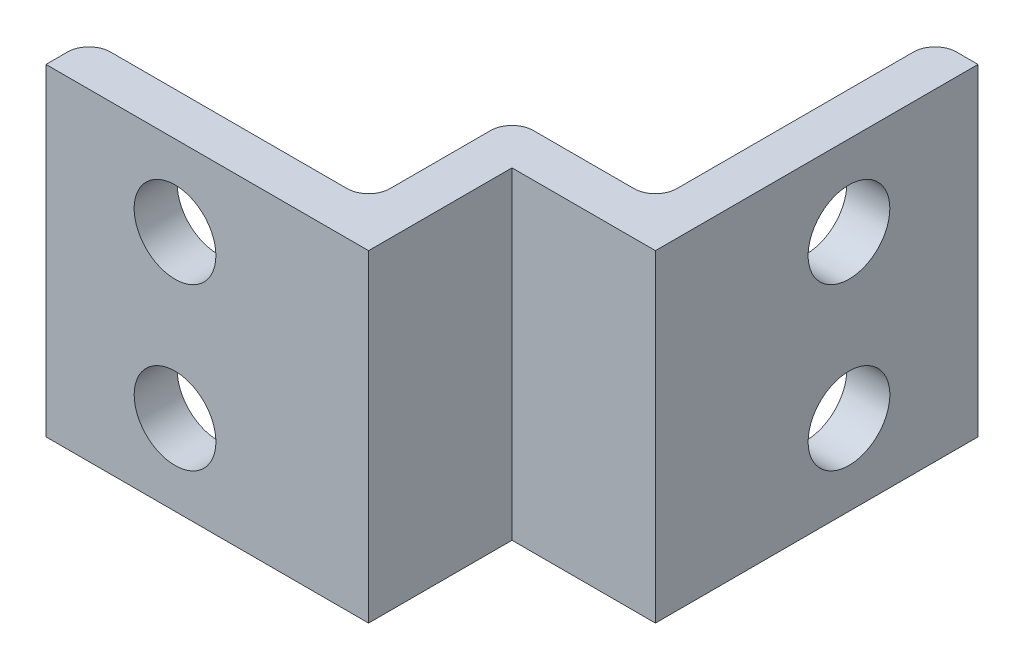
ISO-10303-21;
HEADER;
FILE_DESCRIPTION(('STEP AP214'),'2;1');
FILE_NAME('part.step','',(''),(''),'','','');
FILE_SCHEMA(('AUTOMOTIVE_DESIGN { 1 0 10303 214 1 1 1 1 }'));
ENDSEC;
DATA;
#1=APPLICATION_CONTEXT('core data for automotive mechanical design processes');
#2=APPLICATION_PROTOCOL_DEFINITION('international standard','automotive_design',2000,#1);
#3=PRODUCT_CONTEXT('',#1,'mechanical');
#4=PRODUCT('Part','Part','',(#3));
#5=PRODUCT_RELATED_PRODUCT_CATEGORY('part','',(#4));
#6=PRODUCT_DEFINITION_FORMATION('','',#4);
#7=PRODUCT_DEFINITION_CONTEXT('part definition',#1,'design');
#8=PRODUCT_DEFINITION('design','',#6,#7);
#9=PRODUCT_DEFINITION_SHAPE('','',#8);
#10=(LENGTH_UNIT() NAMED_UNIT(*) SI_UNIT(.MILLI.,.METRE.));
#11=(NAMED_UNIT(*) PLANE_ANGLE_UNIT() SI_UNIT($,.RADIAN.));
#12=(NAMED_UNIT(*) SI_UNIT($,.STERADIAN.) SOLID_ANGLE_UNIT());
#13=UNCERTAINTY_MEASURE_WITH_UNIT(LENGTH_MEASURE(1.E-05),#10,'distance_accuracy_value','');
#14=(GEOMETRIC_REPRESENTATION_CONTEXT(3) GLOBAL_UNCERTAINTY_ASSIGNED_CONTEXT((#13)) GLOBAL_UNIT_ASSIGNED_CONTEXT((#10,
#11,#12)) REPRESENTATION_CONTEXT('',''));
#15=CARTESIAN_POINT('',(0.,0.,0.));
#16=DIRECTION('',(0.,0.,1.));
#17=DIRECTION('',(1.,0.,0.));
#18=AXIS2_PLACEMENT_3D('',#15,#16,#17);
#19=CARTESIAN_POINT('',(38.1,0.,-5.08));
#20=DIRECTION('',(1.,0.,0.));
#21=DIRECTION('',(0.,0.,-1.));
#22=AXIS2_PLACEMENT_3D('',#19,#20,#21);
#23=PLANE('',#22);
#24=DIRECTION('',(0.,0.,1.));
#25=VECTOR('',#24,1.);
#26=CARTESIAN_POINT('',(38.1,0.,-5.08));
#27=LINE('',#26,#25);
#28=CARTESIAN_POINT('',(38.1,0.,-16.9418));
#29=VERTEX_POINT('',#28);
#30=CARTESIAN_POINT('',(38.1,0.,0.));
#31=VERTEX_POINT('',#30);
#32=EDGE_CURVE('E215',#29,#31,#27,.T.);
#33=ORIENTED_EDGE('',*,*,#32,.F.);
#34=DIRECTION('',(0.,1.,0.));
#35=VECTOR('',#34,1.);
#36=CARTESIAN_POINT('',(38.1,0.,-16.9418));
#37=LINE('',#36,#35);
#38=CARTESIAN_POINT('',(38.1,38.1,-16.9418));
#39=VERTEX_POINT('',#38);
#40=EDGE_CURVE('E161',#29,#39,#37,.T.);
#41=ORIENTED_EDGE('',*,*,#40,.T.);
#42=DIRECTION('',(0.,0.,1.));
#43=VECTOR('',#42,1.);
#44=CARTESIAN_POINT('',(38.1,38.1,-5.08));
#45=LINE('',#44,#43);
#46=CARTESIAN_POINT('',(38.1,38.1,0.));
#47=VERTEX_POINT('',#46);
#48=EDGE_CURVE('E213',#39,#47,#45,.T.);
#49=ORIENTED_EDGE('',*,*,#48,.T.);
#50=DIRECTION('',(0.,1.,0.));
#51=VECTOR('',#50,1.);
#52=CARTESIAN_POINT('',(38.1,0.,0.));
#53=LINE('',#52,#51);
#54=EDGE_CURVE('E205',#31,#47,#53,.T.);
#55=ORIENTED_EDGE('',*,*,#54,.F.);
#56=EDGE_LOOP('',(#33,#41,#49,#55));
#57=FACE_BOUND('',#56,.T.);
#58=ADVANCED_FACE('F35',(#57),#23,.T.);
#59=CARTESIAN_POINT('',(0.,0.,-5.08));
#60=DIRECTION('',(-1.,0.,0.));
#61=DIRECTION('',(0.,0.,1.));
#62=AXIS2_PLACEMENT_3D('',#59,#60,#61);
#63=PLANE('',#62);
#64=DIRECTION('',(0.,0.,1.));
#65=VECTOR('',#64,1.);
#66=CARTESIAN_POINT('',(0.,38.1,-5.08));
#67=LINE('',#66,#65);
#68=CARTESIAN_POINT('',(0.,38.1,-2.54));
#69=VERTEX_POINT('',#68);
#70=CARTESIAN_POINT('',(0.,38.1,0.));
#71=VERTEX_POINT('',#70);
#72=EDGE_CURVE('E210',#69,#71,#67,.T.);
#73=ORIENTED_EDGE('',*,*,#72,.F.);
#74=DIRECTION('',(0.,-1.,0.));
#75=VECTOR('',#74,1.);
#76=CARTESIAN_POINT('',(0.,0.,-2.54));
#77=LINE('',#76,#75);
#78=CARTESIAN_POINT('',(0.,0.,-2.54));
#79=VERTEX_POINT('',#78);
#80=EDGE_CURVE('E259',#69,#79,#77,.T.);
#81=ORIENTED_EDGE('',*,*,#80,.T.);
#82=DIRECTION('',(0.,0.,1.));
#83=VECTOR('',#82,1.);
#84=CARTESIAN_POINT('',(0.,0.,-5.08));
#85=LINE('',#84,#83);
#86=CARTESIAN_POINT('',(0.,0.,0.));
#87=VERTEX_POINT('',#86);
#88=EDGE_CURVE('E199',#79,#87,#85,.T.);
#89=ORIENTED_EDGE('',*,*,#88,.T.);
#90=DIRECTION('',(0.,-1.,0.));
#91=VECTOR('',#90,1.);
#92=CARTESIAN_POINT('',(0.,0.,0.));
#93=LINE('',#92,#91);
#94=EDGE_CURVE('E192',#71,#87,#93,.T.);
#95=ORIENTED_EDGE('',*,*,#94,.F.);
#96=EDGE_LOOP('',(#73,#81,#89,#95));
#97=FACE_BOUND('',#96,.T.);
#98=ADVANCED_FACE('F265',(#97),#63,.T.);
#99=CARTESIAN_POINT('',(0.,38.1,-5.08));
#100=DIRECTION('',(0.,1.,0.));
#101=DIRECTION('',(0.,0.,1.));
#102=AXIS2_PLACEMENT_3D('',#99,#100,#101);
#103=PLANE('',#102);
#104=DIRECTION('',(-1.,0.,0.));
#105=VECTOR('',#104,1.);
#106=CARTESIAN_POINT('',(0.,38.1,-5.08));
#107=LINE('',#106,#105);
#108=CARTESIAN_POINT('',(30.48,38.1,-5.08));
#109=VERTEX_POINT('',#108);
#110=CARTESIAN_POINT('',(2.54,38.1,-5.08));
#111=VERTEX_POINT('',#110);
#112=EDGE_CURVE('E196',#109,#111,#107,.T.);
#113=ORIENTED_EDGE('',*,*,#112,.T.);
#114=CARTESIAN_POINT('',(2.54,38.1,-2.54));
#115=DIRECTION('',(0.,1.,0.));
#116=DIRECTION('',(0.,0.,1.));
#117=AXIS2_PLACEMENT_3D('',#114,#115,#116);
#118=CIRCLE('',#117,2.54);
#119=EDGE_CURVE('E11',#111,#69,#118,.T.);
#120=ORIENTED_EDGE('',*,*,#119,.T.);
#121=ORIENTED_EDGE('',*,*,#72,.T.);
#122=DIRECTION('',(-1.,0.,0.));
#123=VECTOR('',#122,1.);
#124=CARTESIAN_POINT('',(0.,38.1,0.));
#125=LINE('',#124,#123);
#126=EDGE_CURVE('E197',#47,#71,#125,.T.);
#127=ORIENTED_EDGE('',*,*,#126,.F.);
#128=ORIENTED_EDGE('',*,*,#48,.F.);
#129=DIRECTION('',(1.,0.,0.));
#130=VECTOR('',#129,1.);
#131=CARTESIAN_POINT('',(33.02,38.1,-16.9418));
#132=LINE('',#131,#130);
#133=CARTESIAN_POINT('',(55.0418,38.1,-16.9418));
#134=VERTEX_POINT('',#133);
#135=EDGE_CURVE('E176',#39,#134,#132,.T.);
#136=ORIENTED_EDGE('',*,*,#135,.T.);
#137=DIRECTION('',(0.,0.,-1.));
#138=VECTOR('',#137,1.);
#139=CARTESIAN_POINT('',(55.0418,38.1,-16.9418));
#140=LINE('',#139,#138);
#141=CARTESIAN_POINT('',(55.0418,38.1,-55.0418));
#142=VERTEX_POINT('',#141);
#143=EDGE_CURVE('E162',#134,#142,#140,.T.);
#144=ORIENTED_EDGE('',*,*,#143,.T.);
#145=DIRECTION('',(1.,0.,0.));
#146=VECTOR('',#145,1.);
#147=CARTESIAN_POINT('',(49.9618,38.1,-55.0418));
#148=LINE('',#147,#146);
#149=CARTESIAN_POINT('',(52.5018,38.1,-55.0418));
#150=VERTEX_POINT('',#149);
#151=EDGE_CURVE('E150',#150,#142,#148,.T.);
#152=ORIENTED_EDGE('',*,*,#151,.F.);
#153=CARTESIAN_POINT('',(52.5018,38.1,-52.5018));
#154=DIRECTION('',(0.,1.,0.));
#155=DIRECTION('',(0.,0.,1.));
#156=AXIS2_PLACEMENT_3D('',#153,#154,#155);
#157=CIRCLE('',#156,2.54);
#158=CARTESIAN_POINT('',(49.9618,38.1,-52.5018));
#159=VERTEX_POINT('',#158);
#160=EDGE_CURVE('E222',#150,#159,#157,.T.);
#161=ORIENTED_EDGE('',*,*,#160,.T.);
#162=DIRECTION('',(0.,0.,1.));
#163=VECTOR('',#162,1.);
#164=CARTESIAN_POINT('',(49.9618,38.1,-16.9418));
#165=LINE('',#164,#163);
#166=CARTESIAN_POINT('',(49.9618,38.1,-24.5618));
#167=VERTEX_POINT('',#166);
#168=EDGE_CURVE('E151',#159,#167,#165,.T.);
#169=ORIENTED_EDGE('',*,*,#168,.T.);
#170=CARTESIAN_POINT('',(47.4218,38.1,-24.5618));
#171=DIRECTION('',(0.,1.,0.));
#172=DIRECTION('',(0.,0.,1.));
#173=AXIS2_PLACEMENT_3D('',#170,#171,#172);
#174=CIRCLE('',#173,2.54);
#175=CARTESIAN_POINT('',(47.4218,38.1,-22.0218));
#176=VERTEX_POINT('',#175);
#177=EDGE_CURVE('E234',#167,#176,#174,.F.);
#178=ORIENTED_EDGE('',*,*,#177,.T.);
#179=DIRECTION('',(1.,0.,0.));
#180=VECTOR('',#179,1.);
#181=CARTESIAN_POINT('',(33.02,38.1,-22.0218));
#182=LINE('',#181,#180);
#183=CARTESIAN_POINT('',(35.56,38.1,-22.0218));
#184=VERTEX_POINT('',#183);
#185=EDGE_CURVE('E190',#184,#176,#182,.T.);
#186=ORIENTED_EDGE('',*,*,#185,.F.);
#187=CARTESIAN_POINT('',(35.56,38.1,-19.4818));
#188=DIRECTION('',(0.,1.,0.));
#189=DIRECTION('',(0.,0.,1.));
#190=AXIS2_PLACEMENT_3D('',#187,#188,#189);
#191=CIRCLE('',#190,2.54);
#192=CARTESIAN_POINT('',(33.02,38.1,-19.4818));
#193=VERTEX_POINT('',#192);
#194=EDGE_CURVE('E242',#184,#193,#191,.T.);
#195=ORIENTED_EDGE('',*,*,#194,.T.);
#196=DIRECTION('',(0.,0.,1.));
#197=VECTOR('',#196,1.);
#198=CARTESIAN_POINT('',(33.02,38.1,0.));
#199=LINE('',#198,#197);
#200=CARTESIAN_POINT('',(33.02,38.1,-7.62));
#201=VERTEX_POINT('',#200);
#202=EDGE_CURVE('E186',#193,#201,#199,.T.);
#203=ORIENTED_EDGE('',*,*,#202,.T.);
#204=CARTESIAN_POINT('',(30.48,38.1,-7.62));
#205=DIRECTION('',(0.,1.,0.));
#206=DIRECTION('',(0.,0.,1.));
#207=AXIS2_PLACEMENT_3D('',#204,#205,#206);
#208=CIRCLE('',#207,2.54);
#209=EDGE_CURVE('E255',#201,#109,#208,.F.);
#210=ORIENTED_EDGE('',*,*,#209,.T.);
#211=EDGE_LOOP('',(#113,#120,#121,#127,#128,#136,#144,#152,#161,#169,#178,#186,#195,#203,#210));
#212=FACE_BOUND('',#211,.T.);
#213=ADVANCED_FACE('F277',(#212),#103,.T.);
#214=CARTESIAN_POINT('',(0.,0.,-5.08));
#215=DIRECTION('',(0.,-1.,0.));
#216=DIRECTION('',(0.,0.,-1.));
#217=AXIS2_PLACEMENT_3D('',#214,#215,#216);
#218=PLANE('',#217);
#219=ORIENTED_EDGE('',*,*,#88,.F.);
#220=CARTESIAN_POINT('',(2.54,0.,-2.54));
#221=DIRECTION('',(0.,-1.,0.));
#222=DIRECTION('',(0.,0.,-1.));
#223=AXIS2_PLACEMENT_3D('',#220,#221,#222);
#224=CIRCLE('',#223,2.54);
#225=CARTESIAN_POINT('',(2.54,0.,-5.08));
#226=VERTEX_POINT('',#225);
#227=EDGE_CURVE('E57',#79,#226,#224,.T.);
#228=ORIENTED_EDGE('',*,*,#227,.T.);
#229=DIRECTION('',(1.,0.,0.));
#230=VECTOR('',#229,1.);
#231=CARTESIAN_POINT('',(0.,0.,-5.08));
#232=LINE('',#231,#230);
#233=CARTESIAN_POINT('',(30.48,0.,-5.08));
#234=VERTEX_POINT('',#233);
#235=EDGE_CURVE('E194',#226,#234,#232,.T.);
#236=ORIENTED_EDGE('',*,*,#235,.T.);
#237=CARTESIAN_POINT('',(30.48,0.,-7.62));
#238=DIRECTION('',(0.,-1.,0.));
#239=DIRECTION('',(0.,0.,-1.));
#240=AXIS2_PLACEMENT_3D('',#237,#238,#239);
#241=CIRCLE('',#240,2.54);
#242=CARTESIAN_POINT('',(33.02,0.,-7.62));
#243=VERTEX_POINT('',#242);
#244=EDGE_CURVE('E257',#234,#243,#241,.F.);
#245=ORIENTED_EDGE('',*,*,#244,.T.);
#246=DIRECTION('',(0.,0.,-1.));
#247=VECTOR('',#246,1.);
#248=CARTESIAN_POINT('',(33.02,0.,0.));
#249=LINE('',#248,#247);
#250=CARTESIAN_POINT('',(33.02,0.,-19.4818));
#251=VERTEX_POINT('',#250);
#252=EDGE_CURVE('E184',#243,#251,#249,.T.);
#253=ORIENTED_EDGE('',*,*,#252,.T.);
#254=CARTESIAN_POINT('',(35.56,0.,-19.4818));
#255=DIRECTION('',(0.,-1.,0.));
#256=DIRECTION('',(0.,0.,-1.));
#257=AXIS2_PLACEMENT_3D('',#254,#255,#256);
#258=CIRCLE('',#257,2.54);
#259=CARTESIAN_POINT('',(35.56,0.,-22.0218));
#260=VERTEX_POINT('',#259);
#261=EDGE_CURVE('E247',#251,#260,#258,.T.);
#262=ORIENTED_EDGE('',*,*,#261,.T.);
#263=DIRECTION('',(1.,0.,0.));
#264=VECTOR('',#263,1.);
#265=CARTESIAN_POINT('',(33.02,0.,-22.0218));
#266=LINE('',#265,#264);
#267=CARTESIAN_POINT('',(47.4218,0.,-22.0218));
#268=VERTEX_POINT('',#267);
#269=EDGE_CURVE('E189',#260,#268,#266,.T.);
#270=ORIENTED_EDGE('',*,*,#269,.T.);
#271=CARTESIAN_POINT('',(47.4218,0.,-24.5618));
#272=DIRECTION('',(0.,-1.,0.));
#273=DIRECTION('',(0.,0.,-1.));
#274=AXIS2_PLACEMENT_3D('',#271,#272,#273);
#275=CIRCLE('',#274,2.54);
#276=CARTESIAN_POINT('',(49.9618,0.,-24.5618));
#277=VERTEX_POINT('',#276);
#278=EDGE_CURVE('E237',#268,#277,#275,.F.);
#279=ORIENTED_EDGE('',*,*,#278,.T.);
#280=DIRECTION('',(0.,0.,-1.));
#281=VECTOR('',#280,1.);
#282=CARTESIAN_POINT('',(49.9618,0.,-16.9418));
#283=LINE('',#282,#281);
#284=CARTESIAN_POINT('',(49.9618,0.,-52.5018));
#285=VERTEX_POINT('',#284);
#286=EDGE_CURVE('E167',#277,#285,#283,.T.);
#287=ORIENTED_EDGE('',*,*,#286,.T.);
#288=CARTESIAN_POINT('',(52.5018,0.,-52.5018));
#289=DIRECTION('',(0.,-1.,0.));
#290=DIRECTION('',(0.,0.,-1.));
#291=AXIS2_PLACEMENT_3D('',#288,#289,#290);
#292=CIRCLE('',#291,2.54);
#293=CARTESIAN_POINT('',(52.5018,0.,-55.0418));
#294=VERTEX_POINT('',#293);
#295=EDGE_CURVE('E145',#285,#294,#292,.T.);
#296=ORIENTED_EDGE('',*,*,#295,.T.);
#297=DIRECTION('',(1.,0.,0.));
#298=VECTOR('',#297,1.);
#299=CARTESIAN_POINT('',(49.9618,0.,-55.0418));
#300=LINE('',#299,#298);
#301=CARTESIAN_POINT('',(55.0418,0.,-55.0418));
#302=VERTEX_POINT('',#301);
#303=EDGE_CURVE('E139',#294,#302,#300,.T.);
#304=ORIENTED_EDGE('',*,*,#303,.T.);
#305=DIRECTION('',(0.,0.,-1.));
#306=VECTOR('',#305,1.);
#307=CARTESIAN_POINT('',(55.0418,0.,-16.9418));
#308=LINE('',#307,#306);
#309=CARTESIAN_POINT('',(55.0418,0.,-16.9418));
#310=VERTEX_POINT('',#309);
#311=EDGE_CURVE('E142',#310,#302,#308,.T.);
#312=ORIENTED_EDGE('',*,*,#311,.F.);
#313=DIRECTION('',(-1.,0.,0.));
#314=VECTOR('',#313,1.);
#315=CARTESIAN_POINT('',(33.02,0.,-16.9418));
#316=LINE('',#315,#314);
#317=EDGE_CURVE('E180',#310,#29,#316,.T.);
#318=ORIENTED_EDGE('',*,*,#317,.T.);
#319=ORIENTED_EDGE('',*,*,#32,.T.);
#320=DIRECTION('',(1.,0.,0.));
#321=VECTOR('',#320,1.);
#322=CARTESIAN_POINT('',(0.,0.,0.));
#323=LINE('',#322,#321);
#324=EDGE_CURVE('E202',#87,#31,#323,.T.);
#325=ORIENTED_EDGE('',*,*,#324,.F.);
#326=EDGE_LOOP('',(#219,#228,#236,#245,#253,#262,#270,#279,#287,#296,#304,#312,#318,#319,#325));
#327=FACE_BOUND('',#326,.T.);
#328=ADVANCED_FACE('F141',(#327),#218,.T.);
#329=CARTESIAN_POINT('',(0.,0.,-5.08));
#330=DIRECTION('',(0.,0.,-1.));
#331=DIRECTION('',(-1.,0.,0.));
#332=AXIS2_PLACEMENT_3D('',#329,#330,#331);
#333=PLANE('',#332);
#334=CARTESIAN_POINT('',(15.24,28.575,-5.08));
#335=DIRECTION('',(0.,0.,-1.));
#336=DIRECTION('',(-1.,0.,0.));
#337=AXIS2_PLACEMENT_3D('',#334,#335,#336);
#338=CIRCLE('',#337,4.826);
#339=CARTESIAN_POINT('',(10.414,28.575,-5.08));
#340=VERTEX_POINT('',#339);
#341=EDGE_CURVE('E369',#340,#340,#338,.T.);
#342=ORIENTED_EDGE('',*,*,#341,.F.);
#343=EDGE_LOOP('',(#342));
#344=FACE_BOUND('',#343,.T.);
#345=CARTESIAN_POINT('',(15.24,9.52500000000001,-5.08));
#346=DIRECTION('',(0.,0.,-1.));
#347=DIRECTION('',(-1.,0.,0.));
#348=AXIS2_PLACEMENT_3D('',#345,#346,#347);
#349=CIRCLE('',#348,4.826);
#350=CARTESIAN_POINT('',(10.414,9.52500000000001,-5.08));
#351=VERTEX_POINT('',#350);
#352=EDGE_CURVE('E364',#351,#351,#349,.T.);
#353=ORIENTED_EDGE('',*,*,#352,.F.);
#354=EDGE_LOOP('',(#353));
#355=FACE_BOUND('',#354,.T.);
#356=ORIENTED_EDGE('',*,*,#235,.F.);
#357=DIRECTION('',(0.,-1.,0.));
#358=VECTOR('',#357,1.);
#359=CARTESIAN_POINT('',(2.54,0.,-5.08));
#360=LINE('',#359,#358);
#361=EDGE_CURVE('E43',#226,#111,#360,.F.);
#362=ORIENTED_EDGE('',*,*,#361,.T.);
#363=ORIENTED_EDGE('',*,*,#112,.F.);
#364=DIRECTION('',(0.,1.,0.));
#365=VECTOR('',#364,1.);
#366=CARTESIAN_POINT('',(30.48,0.,-5.08));
#367=LINE('',#366,#365);
#368=EDGE_CURVE('E252',#109,#234,#367,.F.);
#369=ORIENTED_EDGE('',*,*,#368,.T.);
#370=EDGE_LOOP('',(#356,#362,#363,#369));
#371=FACE_BOUND('',#370,.T.);
#372=ADVANCED_FACE('F297',(#344,#355,#371),#333,.T.);
#373=CARTESIAN_POINT('',(0.,0.,0.));
#374=DIRECTION('',(0.,0.,-1.));
#375=DIRECTION('',(-1.,0.,0.));
#376=AXIS2_PLACEMENT_3D('',#373,#374,#375);
#377=PLANE('',#376);
#378=CARTESIAN_POINT('',(15.24,28.575,0.));
#379=DIRECTION('',(0.,0.,1.));
#380=DIRECTION('',(1.,0.,0.));
#381=AXIS2_PLACEMENT_3D('',#378,#379,#380);
#382=CIRCLE('',#381,4.826);
#383=CARTESIAN_POINT('',(20.066,28.575,0.));
#384=VERTEX_POINT('',#383);
#385=EDGE_CURVE('E358',#384,#384,#382,.T.);
#386=ORIENTED_EDGE('',*,*,#385,.F.);
#387=EDGE_LOOP('',(#386));
#388=FACE_BOUND('',#387,.T.);
#389=CARTESIAN_POINT('',(15.24,9.52500000000001,0.));
#390=DIRECTION('',(0.,0.,1.));
#391=DIRECTION('',(-1.,0.,0.));
#392=AXIS2_PLACEMENT_3D('',#389,#390,#391);
#393=CIRCLE('',#392,4.826);
#394=CARTESIAN_POINT('',(10.414,9.52500000000001,0.));
#395=VERTEX_POINT('',#394);
#396=EDGE_CURVE('E361',#395,#395,#393,.T.);
#397=ORIENTED_EDGE('',*,*,#396,.F.);
#398=EDGE_LOOP('',(#397));
#399=FACE_BOUND('',#398,.T.);
#400=ORIENTED_EDGE('',*,*,#324,.T.);
#401=ORIENTED_EDGE('',*,*,#54,.T.);
#402=ORIENTED_EDGE('',*,*,#126,.T.);
#403=ORIENTED_EDGE('',*,*,#94,.T.);
#404=EDGE_LOOP('',(#400,#401,#402,#403));
#405=FACE_BOUND('',#404,.T.);
#406=ADVANCED_FACE('F273',(#388,#399,#405),#377,.F.);
#407=CARTESIAN_POINT('',(33.02,0.,-22.0218));
#408=DIRECTION('',(0.,0.,-1.));
#409=DIRECTION('',(-1.,0.,0.));
#410=AXIS2_PLACEMENT_3D('',#407,#408,#409);
#411=PLANE('',#410);
#412=ORIENTED_EDGE('',*,*,#269,.F.);
#413=DIRECTION('',(0.,1.,0.));
#414=VECTOR('',#413,1.);
#415=CARTESIAN_POINT('',(35.56,0.,-22.0218));
#416=LINE('',#415,#414);
#417=EDGE_CURVE('E239',#260,#184,#416,.T.);
#418=ORIENTED_EDGE('',*,*,#417,.T.);
#419=ORIENTED_EDGE('',*,*,#185,.T.);
#420=DIRECTION('',(0.,1.,0.));
#421=VECTOR('',#420,1.);
#422=CARTESIAN_POINT('',(47.4218,0.,-22.0218));
#423=LINE('',#422,#421);
#424=EDGE_CURVE('E231',#176,#268,#423,.F.);
#425=ORIENTED_EDGE('',*,*,#424,.T.);
#426=EDGE_LOOP('',(#412,#418,#419,#425));
#427=FACE_BOUND('',#426,.T.);
#428=ADVANCED_FACE('F318',(#427),#411,.T.);
#429=CARTESIAN_POINT('',(33.02,0.,0.));
#430=DIRECTION('',(-1.,0.,0.));
#431=DIRECTION('',(0.,0.,1.));
#432=AXIS2_PLACEMENT_3D('',#429,#430,#431);
#433=PLANE('',#432);
#434=ORIENTED_EDGE('',*,*,#252,.F.);
#435=DIRECTION('',(0.,1.,0.));
#436=VECTOR('',#435,1.);
#437=CARTESIAN_POINT('',(33.02,38.1,-7.62));
#438=LINE('',#437,#436);
#439=EDGE_CURVE('E249',#243,#201,#438,.T.);
#440=ORIENTED_EDGE('',*,*,#439,.T.);
#441=ORIENTED_EDGE('',*,*,#202,.F.);
#442=DIRECTION('',(0.,1.,0.));
#443=VECTOR('',#442,1.);
#444=CARTESIAN_POINT('',(33.02,0.,-19.4818));
#445=LINE('',#444,#443);
#446=EDGE_CURVE('E244',#193,#251,#445,.F.);
#447=ORIENTED_EDGE('',*,*,#446,.T.);
#448=EDGE_LOOP('',(#434,#440,#441,#447));
#449=FACE_BOUND('',#448,.T.);
#450=ADVANCED_FACE('F339',(#449),#433,.T.);
#451=CARTESIAN_POINT('',(55.0418,0.,-16.9418));
#452=DIRECTION('',(1.,0.,0.));
#453=DIRECTION('',(0.,0.,-1.));
#454=AXIS2_PLACEMENT_3D('',#451,#452,#453);
#455=PLANE('',#454);
#456=CARTESIAN_POINT('',(55.0418,28.575,-39.8018));
#457=DIRECTION('',(1.,0.,0.));
#458=DIRECTION('',(0.,0.,-1.));
#459=AXIS2_PLACEMENT_3D('',#456,#457,#458);
#460=CIRCLE('',#459,4.826);
#461=CARTESIAN_POINT('',(55.0418,28.575,-44.6278));
#462=VERTEX_POINT('',#461);
#463=EDGE_CURVE('E219',#462,#462,#460,.T.);
#464=ORIENTED_EDGE('',*,*,#463,.F.);
#465=EDGE_LOOP('',(#464));
#466=FACE_BOUND('',#465,.T.);
#467=CARTESIAN_POINT('',(55.0418,9.52500000000001,-39.8018));
#468=DIRECTION('',(1.,0.,0.));
#469=DIRECTION('',(0.,0.,1.));
#470=AXIS2_PLACEMENT_3D('',#467,#468,#469);
#471=CIRCLE('',#470,4.826);
#472=CARTESIAN_POINT('',(55.0418,9.52500000000001,-34.9758));
#473=VERTEX_POINT('',#472);
#474=EDGE_CURVE('E372',#473,#473,#471,.T.);
#475=ORIENTED_EDGE('',*,*,#474,.F.);
#476=EDGE_LOOP('',(#475));
#477=FACE_BOUND('',#476,.T.);
#478=ORIENTED_EDGE('',*,*,#311,.T.);
#479=DIRECTION('',(0.,1.,0.));
#480=VECTOR('',#479,1.);
#481=CARTESIAN_POINT('',(55.0418,0.,-55.0418));
#482=LINE('',#481,#480);
#483=EDGE_CURVE('E157',#302,#142,#482,.T.);
#484=ORIENTED_EDGE('',*,*,#483,.T.);
#485=ORIENTED_EDGE('',*,*,#143,.F.);
#486=DIRECTION('',(0.,-1.,0.));
#487=VECTOR('',#486,1.);
#488=CARTESIAN_POINT('',(55.0418,0.,-16.9418));
#489=LINE('',#488,#487);
#490=EDGE_CURVE('E159',#134,#310,#489,.T.);
#491=ORIENTED_EDGE('',*,*,#490,.T.);
#492=EDGE_LOOP('',(#478,#484,#485,#491));
#493=FACE_BOUND('',#492,.T.);
#494=ADVANCED_FACE('F155',(#466,#477,#493),#455,.T.);
#495=CARTESIAN_POINT('',(0.,0.,-16.9418));
#496=DIRECTION('',(0.,0.,-1.));
#497=DIRECTION('',(-1.,0.,0.));
#498=AXIS2_PLACEMENT_3D('',#495,#496,#497);
#499=PLANE('',#498);
#500=ORIENTED_EDGE('',*,*,#40,.F.);
#501=ORIENTED_EDGE('',*,*,#317,.F.);
#502=ORIENTED_EDGE('',*,*,#490,.F.);
#503=ORIENTED_EDGE('',*,*,#135,.F.);
#504=EDGE_LOOP('',(#500,#501,#502,#503));
#505=FACE_BOUND('',#504,.T.);
#506=ADVANCED_FACE('F331',(#505),#499,.F.);
#507=CARTESIAN_POINT('',(49.9618,0.,-55.0418));
#508=DIRECTION('',(0.,0.,-1.));
#509=DIRECTION('',(-1.,0.,0.));
#510=AXIS2_PLACEMENT_3D('',#507,#508,#509);
#511=PLANE('',#510);
#512=ORIENTED_EDGE('',*,*,#303,.F.);
#513=DIRECTION('',(0.,1.,0.));
#514=VECTOR('',#513,1.);
#515=CARTESIAN_POINT('',(52.5018,0.,-55.0418));
#516=LINE('',#515,#514);
#517=EDGE_CURVE('E212',#294,#150,#516,.T.);
#518=ORIENTED_EDGE('',*,*,#517,.T.);
#519=ORIENTED_EDGE('',*,*,#151,.T.);
#520=ORIENTED_EDGE('',*,*,#483,.F.);
#521=EDGE_LOOP('',(#512,#518,#519,#520));
#522=FACE_BOUND('',#521,.T.);
#523=ADVANCED_FACE('F164',(#522),#511,.T.);
#524=CARTESIAN_POINT('',(49.9618,0.,0.));
#525=DIRECTION('',(-1.,0.,0.));
#526=DIRECTION('',(0.,0.,1.));
#527=AXIS2_PLACEMENT_3D('',#524,#525,#526);
#528=PLANE('',#527);
#529=CARTESIAN_POINT('',(49.9618,28.575,-39.8018));
#530=DIRECTION('',(-1.,0.,0.));
#531=DIRECTION('',(0.,0.,1.));
#532=AXIS2_PLACEMENT_3D('',#529,#530,#531);
#533=CIRCLE('',#532,4.826);
#534=CARTESIAN_POINT('',(49.9618,28.575,-34.9758));
#535=VERTEX_POINT('',#534);
#536=EDGE_CURVE('E168',#535,#535,#533,.T.);
#537=ORIENTED_EDGE('',*,*,#536,.F.);
#538=EDGE_LOOP('',(#537));
#539=FACE_BOUND('',#538,.T.);
#540=CARTESIAN_POINT('',(49.9618,9.52500000000001,-39.8018));
#541=DIRECTION('',(-1.,0.,0.));
#542=DIRECTION('',(0.,0.,1.));
#543=AXIS2_PLACEMENT_3D('',#540,#541,#542);
#544=CIRCLE('',#543,4.826);
#545=CARTESIAN_POINT('',(49.9618,9.52500000000001,-34.9758));
#546=VERTEX_POINT('',#545);
#547=EDGE_CURVE('E172',#546,#546,#544,.T.);
#548=ORIENTED_EDGE('',*,*,#547,.F.);
#549=EDGE_LOOP('',(#548));
#550=FACE_BOUND('',#549,.T.);
#551=ORIENTED_EDGE('',*,*,#286,.F.);
#552=DIRECTION('',(0.,1.,0.));
#553=VECTOR('',#552,1.);
#554=CARTESIAN_POINT('',(49.9618,38.1,-24.5618));
#555=LINE('',#554,#553);
#556=EDGE_CURVE('E228',#277,#167,#555,.T.);
#557=ORIENTED_EDGE('',*,*,#556,.T.);
#558=ORIENTED_EDGE('',*,*,#168,.F.);
#559=DIRECTION('',(0.,1.,0.));
#560=VECTOR('',#559,1.);
#561=CARTESIAN_POINT('',(49.9618,0.,-52.5018));
#562=LINE('',#561,#560);
#563=EDGE_CURVE('E224',#159,#285,#562,.F.);
#564=ORIENTED_EDGE('',*,*,#563,.T.);
#565=EDGE_LOOP('',(#551,#557,#558,#564));
#566=FACE_BOUND('',#565,.T.);
#567=ADVANCED_FACE('F325',(#539,#550,#566),#528,.T.);
#568=CARTESIAN_POINT('',(0.,9.52500000000001,-39.8018));
#569=DIRECTION('',(1.,0.,0.));
#570=DIRECTION('',(0.,0.,-1.));
#571=AXIS2_PLACEMENT_3D('',#568,#569,#570);
#572=CYLINDRICAL_SURFACE('',#571,4.826);
#573=ORIENTED_EDGE('',*,*,#547,.T.);
#574=EDGE_LOOP('',(#573));
#575=FACE_BOUND('',#574,.T.);
#576=ORIENTED_EDGE('',*,*,#474,.T.);
#577=EDGE_LOOP('',(#576));
#578=FACE_BOUND('',#577,.T.);
#579=ADVANCED_FACE('F378',(#575,#578),#572,.F.);
#580=CARTESIAN_POINT('',(0.,28.575,-39.8018));
#581=DIRECTION('',(1.,0.,0.));
#582=DIRECTION('',(0.,0.,-1.));
#583=AXIS2_PLACEMENT_3D('',#580,#581,#582);
#584=CYLINDRICAL_SURFACE('',#583,4.826);
#585=ORIENTED_EDGE('',*,*,#536,.T.);
#586=EDGE_LOOP('',(#585));
#587=FACE_BOUND('',#586,.T.);
#588=ORIENTED_EDGE('',*,*,#463,.T.);
#589=EDGE_LOOP('',(#588));
#590=FACE_BOUND('',#589,.T.);
#591=ADVANCED_FACE('F381',(#587,#590),#584,.F.);
#592=CARTESIAN_POINT('',(15.24,9.52500000000001,-55.0418));
#593=DIRECTION('',(0.,0.,1.));
#594=DIRECTION('',(1.,0.,0.));
#595=AXIS2_PLACEMENT_3D('',#592,#593,#594);
#596=CYLINDRICAL_SURFACE('',#595,4.826);
#597=ORIENTED_EDGE('',*,*,#352,.T.);
#598=EDGE_LOOP('',(#597));
#599=FACE_BOUND('',#598,.T.);
#600=ORIENTED_EDGE('',*,*,#396,.T.);
#601=EDGE_LOOP('',(#600));
#602=FACE_BOUND('',#601,.T.);
#603=ADVANCED_FACE('F388',(#599,#602),#596,.F.);
#604=CARTESIAN_POINT('',(15.24,28.575,-55.0418));
#605=DIRECTION('',(0.,0.,1.));
#606=DIRECTION('',(1.,0.,0.));
#607=AXIS2_PLACEMENT_3D('',#604,#605,#606);
#608=CYLINDRICAL_SURFACE('',#607,4.826);
#609=ORIENTED_EDGE('',*,*,#341,.T.);
#610=EDGE_LOOP('',(#609));
#611=FACE_BOUND('',#610,.T.);
#612=ORIENTED_EDGE('',*,*,#385,.T.);
#613=EDGE_LOOP('',(#612));
#614=FACE_BOUND('',#613,.T.);
#615=ADVANCED_FACE('F303',(#611,#614),#608,.F.);
#616=CARTESIAN_POINT('',(52.5018,0.,-52.5018));
#617=DIRECTION('',(0.,1.,0.));
#618=DIRECTION('',(0.,0.,1.));
#619=AXIS2_PLACEMENT_3D('',#616,#617,#618);
#620=CYLINDRICAL_SURFACE('',#619,2.54);
#621=ORIENTED_EDGE('',*,*,#295,.F.);
#622=ORIENTED_EDGE('',*,*,#563,.F.);
#623=ORIENTED_EDGE('',*,*,#160,.F.);
#624=ORIENTED_EDGE('',*,*,#517,.F.);
#625=EDGE_LOOP('',(#621,#622,#623,#624));
#626=FACE_BOUND('',#625,.T.);
#627=ADVANCED_FACE('F299',(#626),#620,.T.);
#628=CARTESIAN_POINT('',(47.4218,0.,-24.5618));
#629=DIRECTION('',(0.,-1.,0.));
#630=DIRECTION('',(0.,0.,-1.));
#631=AXIS2_PLACEMENT_3D('',#628,#629,#630);
#632=CYLINDRICAL_SURFACE('',#631,2.54);
#633=ORIENTED_EDGE('',*,*,#278,.F.);
#634=ORIENTED_EDGE('',*,*,#424,.F.);
#635=ORIENTED_EDGE('',*,*,#177,.F.);
#636=ORIENTED_EDGE('',*,*,#556,.F.);
#637=EDGE_LOOP('',(#633,#634,#635,#636));
#638=FACE_BOUND('',#637,.T.);
#639=ADVANCED_FACE('F302',(#638),#632,.F.);
#640=CARTESIAN_POINT('',(35.56,0.,-19.4818));
#641=DIRECTION('',(0.,1.,0.));
#642=DIRECTION('',(0.,0.,1.));
#643=AXIS2_PLACEMENT_3D('',#640,#641,#642);
#644=CYLINDRICAL_SURFACE('',#643,2.54);
#645=ORIENTED_EDGE('',*,*,#261,.F.);
#646=ORIENTED_EDGE('',*,*,#446,.F.);
#647=ORIENTED_EDGE('',*,*,#194,.F.);
#648=ORIENTED_EDGE('',*,*,#417,.F.);
#649=EDGE_LOOP('',(#645,#646,#647,#648));
#650=FACE_BOUND('',#649,.T.);
#651=ADVANCED_FACE('F284',(#650),#644,.T.);
#652=CARTESIAN_POINT('',(30.48,0.,-7.62));
#653=DIRECTION('',(0.,-1.,0.));
#654=DIRECTION('',(0.,0.,-1.));
#655=AXIS2_PLACEMENT_3D('',#652,#653,#654);
#656=CYLINDRICAL_SURFACE('',#655,2.54);
#657=ORIENTED_EDGE('',*,*,#244,.F.);
#658=ORIENTED_EDGE('',*,*,#368,.F.);
#659=ORIENTED_EDGE('',*,*,#209,.F.);
#660=ORIENTED_EDGE('',*,*,#439,.F.);
#661=EDGE_LOOP('',(#657,#658,#659,#660));
#662=FACE_BOUND('',#661,.T.);
#663=ADVANCED_FACE('F280',(#662),#656,.F.);
#664=CARTESIAN_POINT('',(2.54,0.,-2.54));
#665=DIRECTION('',(0.,-1.,0.));
#666=DIRECTION('',(0.,0.,-1.));
#667=AXIS2_PLACEMENT_3D('',#664,#665,#666);
#668=CYLINDRICAL_SURFACE('',#667,2.54);
#669=ORIENTED_EDGE('',*,*,#119,.F.);
#670=ORIENTED_EDGE('',*,*,#361,.F.);
#671=ORIENTED_EDGE('',*,*,#227,.F.);
#672=ORIENTED_EDGE('',*,*,#80,.F.);
#673=EDGE_LOOP('',(#669,#670,#671,#672));
#674=FACE_BOUND('',#673,.T.);
#675=ADVANCED_FACE('F37',(#674),#668,.T.);
#676=CLOSED_SHELL('',(#58,#98,#213,#328,#372,#406,#428,#450,#494,#506,#523,#567,#579,#591,#603,
#615,#627,#639,#651,#663,#675));
#677=MANIFOLD_SOLID_BREP('B2',#676);
#678=ADVANCED_BREP_SHAPE_REPRESENTATION('',(#18,#677),#14);
#679=SHAPE_DEFINITION_REPRESENTATION(#9,#678);
ENDSEC;
END-ISO-10303-21;
